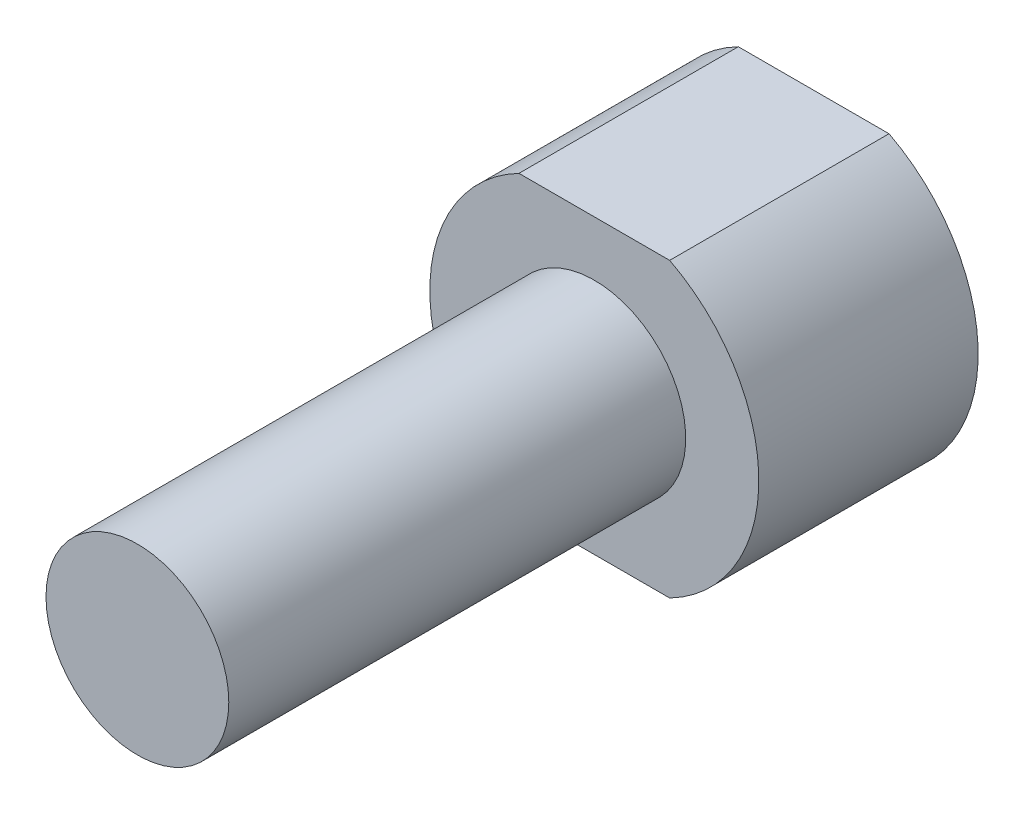
ISO-10303-21;
HEADER;
FILE_DESCRIPTION(('STEP AP214'),'2;1');
FILE_NAME('part.step','',(''),(''),'','','');
FILE_SCHEMA(('AUTOMOTIVE_DESIGN { 1 0 10303 214 1 1 1 1 }'));
ENDSEC;
DATA;
#1=APPLICATION_CONTEXT('core data for automotive mechanical design processes');
#2=APPLICATION_PROTOCOL_DEFINITION('international standard','automotive_design',2000,#1);
#3=PRODUCT_CONTEXT('',#1,'mechanical');
#4=PRODUCT('Part','Part','',(#3));
#5=PRODUCT_RELATED_PRODUCT_CATEGORY('part','',(#4));
#6=PRODUCT_DEFINITION_FORMATION('','',#4);
#7=PRODUCT_DEFINITION_CONTEXT('part definition',#1,'design');
#8=PRODUCT_DEFINITION('design','',#6,#7);
#9=PRODUCT_DEFINITION_SHAPE('','',#8);
#10=(LENGTH_UNIT() NAMED_UNIT(*) SI_UNIT(.MILLI.,.METRE.));
#11=(NAMED_UNIT(*) PLANE_ANGLE_UNIT() SI_UNIT($,.RADIAN.));
#12=(NAMED_UNIT(*) SI_UNIT($,.STERADIAN.) SOLID_ANGLE_UNIT());
#13=UNCERTAINTY_MEASURE_WITH_UNIT(LENGTH_MEASURE(1.E-05),#10,'distance_accuracy_value','');
#14=(GEOMETRIC_REPRESENTATION_CONTEXT(3) GLOBAL_UNCERTAINTY_ASSIGNED_CONTEXT((#13)) GLOBAL_UNIT_ASSIGNED_CONTEXT((#10,
#11,#12)) REPRESENTATION_CONTEXT('',''));
#15=CARTESIAN_POINT('',(0.,0.,0.));
#16=DIRECTION('',(0.,0.,1.));
#17=DIRECTION('',(1.,0.,0.));
#18=AXIS2_PLACEMENT_3D('',#15,#16,#17);
#19=CARTESIAN_POINT('',(0.,0.,12.));
#20=DIRECTION('',(0.,0.,-1.));
#21=DIRECTION('',(-1.,0.,0.));
#22=AXIS2_PLACEMENT_3D('',#19,#20,#21);
#23=CYLINDRICAL_SURFACE('',#22,9.);
#24=CARTESIAN_POINT('',(0.,0.,0.));
#25=DIRECTION('',(0.,0.,1.));
#26=DIRECTION('',(-1.,0.,0.));
#27=AXIS2_PLACEMENT_3D('',#24,#25,#26);
#28=CIRCLE('',#27,9.);
#29=CARTESIAN_POINT('',(4.12310562561766,-8.,0.));
#30=VERTEX_POINT('',#29);
#31=CARTESIAN_POINT('',(4.12310562561766,8.,0.));
#32=VERTEX_POINT('',#31);
#33=EDGE_CURVE('E103',#30,#32,#28,.T.);
#34=ORIENTED_EDGE('',*,*,#33,.T.);
#35=DIRECTION('',(0.,0.,-1.));
#36=VECTOR('',#35,1.);
#37=CARTESIAN_POINT('',(4.12310562561766,8.,12.));
#38=LINE('',#37,#36);
#39=CARTESIAN_POINT('',(4.12310562561766,8.,12.));
#40=VERTEX_POINT('',#39);
#41=EDGE_CURVE('E45',#40,#32,#38,.T.);
#42=ORIENTED_EDGE('',*,*,#41,.F.);
#43=CARTESIAN_POINT('',(0.,0.,12.));
#44=DIRECTION('',(0.,0.,1.));
#45=DIRECTION('',(-1.,0.,0.));
#46=AXIS2_PLACEMENT_3D('',#43,#44,#45);
#47=CIRCLE('',#46,9.);
#48=CARTESIAN_POINT('',(4.12310562561766,-8.,12.));
#49=VERTEX_POINT('',#48);
#50=EDGE_CURVE('E89',#49,#40,#47,.T.);
#51=ORIENTED_EDGE('',*,*,#50,.F.);
#52=DIRECTION('',(0.,0.,-1.));
#53=VECTOR('',#52,1.);
#54=CARTESIAN_POINT('',(4.12310562561766,-8.,12.));
#55=LINE('',#54,#53);
#56=EDGE_CURVE('E99',#49,#30,#55,.T.);
#57=ORIENTED_EDGE('',*,*,#56,.T.);
#58=EDGE_LOOP('',(#34,#42,#51,#57));
#59=FACE_BOUND('',#58,.T.);
#60=ADVANCED_FACE('F37',(#59),#23,.T.);
#61=CARTESIAN_POINT('',(-4.12310562561766,8.,12.));
#62=DIRECTION('',(0.,-1.,0.));
#63=DIRECTION('',(0.,0.,-1.));
#64=AXIS2_PLACEMENT_3D('',#61,#62,#63);
#65=PLANE('',#64);
#66=DIRECTION('',(-1.,0.,0.));
#67=VECTOR('',#66,1.);
#68=CARTESIAN_POINT('',(-4.12310562561766,8.,0.));
#69=LINE('',#68,#67);
#70=CARTESIAN_POINT('',(-4.12310562561766,8.,0.));
#71=VERTEX_POINT('',#70);
#72=EDGE_CURVE('E94',#32,#71,#69,.T.);
#73=ORIENTED_EDGE('',*,*,#72,.T.);
#74=DIRECTION('',(0.,0.,-1.));
#75=VECTOR('',#74,1.);
#76=CARTESIAN_POINT('',(-4.12310562561766,8.,12.));
#77=LINE('',#76,#75);
#78=CARTESIAN_POINT('',(-4.12310562561766,8.,12.));
#79=VERTEX_POINT('',#78);
#80=EDGE_CURVE('E92',#79,#71,#77,.T.);
#81=ORIENTED_EDGE('',*,*,#80,.F.);
#82=DIRECTION('',(-1.,0.,0.));
#83=VECTOR('',#82,1.);
#84=CARTESIAN_POINT('',(-4.12310562561766,8.,12.));
#85=LINE('',#84,#83);
#86=EDGE_CURVE('E84',#40,#79,#85,.T.);
#87=ORIENTED_EDGE('',*,*,#86,.F.);
#88=ORIENTED_EDGE('',*,*,#41,.T.);
#89=EDGE_LOOP('',(#73,#81,#87,#88));
#90=FACE_BOUND('',#89,.T.);
#91=ADVANCED_FACE('F93',(#90),#65,.F.);
#92=CARTESIAN_POINT('',(0.,0.,12.));
#93=DIRECTION('',(0.,0.,-1.));
#94=DIRECTION('',(-1.,0.,0.));
#95=AXIS2_PLACEMENT_3D('',#92,#93,#94);
#96=CYLINDRICAL_SURFACE('',#95,9.);
#97=CARTESIAN_POINT('',(0.,0.,0.));
#98=DIRECTION('',(0.,0.,1.));
#99=DIRECTION('',(1.,0.,0.));
#100=AXIS2_PLACEMENT_3D('',#97,#98,#99);
#101=CIRCLE('',#100,9.);
#102=CARTESIAN_POINT('',(-4.12310562561767,-7.99999999999999,0.));
#103=VERTEX_POINT('',#102);
#104=EDGE_CURVE('E70',#71,#103,#101,.T.);
#105=ORIENTED_EDGE('',*,*,#104,.T.);
#106=DIRECTION('',(0.,0.,-1.));
#107=VECTOR('',#106,1.);
#108=CARTESIAN_POINT('',(-4.12310562561767,-7.99999999999999,12.));
#109=LINE('',#108,#107);
#110=CARTESIAN_POINT('',(-4.12310562561767,-7.99999999999999,12.));
#111=VERTEX_POINT('',#110);
#112=EDGE_CURVE('E95',#111,#103,#109,.T.);
#113=ORIENTED_EDGE('',*,*,#112,.F.);
#114=CARTESIAN_POINT('',(0.,0.,12.));
#115=DIRECTION('',(0.,0.,1.));
#116=DIRECTION('',(1.,0.,0.));
#117=AXIS2_PLACEMENT_3D('',#114,#115,#116);
#118=CIRCLE('',#117,9.);
#119=EDGE_CURVE('E87',#79,#111,#118,.T.);
#120=ORIENTED_EDGE('',*,*,#119,.F.);
#121=ORIENTED_EDGE('',*,*,#80,.T.);
#122=EDGE_LOOP('',(#105,#113,#120,#121));
#123=FACE_BOUND('',#122,.T.);
#124=ADVANCED_FACE('F97',(#123),#96,.T.);
#125=CARTESIAN_POINT('',(4.12310562561766,-8.,12.));
#126=DIRECTION('',(0.,1.,0.));
#127=DIRECTION('',(0.,0.,1.));
#128=AXIS2_PLACEMENT_3D('',#125,#126,#127);
#129=PLANE('',#128);
#130=DIRECTION('',(1.,0.,0.));
#131=VECTOR('',#130,1.);
#132=CARTESIAN_POINT('',(4.12310562561766,-8.,0.));
#133=LINE('',#132,#131);
#134=EDGE_CURVE('E76',#103,#30,#133,.T.);
#135=ORIENTED_EDGE('',*,*,#134,.T.);
#136=ORIENTED_EDGE('',*,*,#56,.F.);
#137=DIRECTION('',(1.,0.,0.));
#138=VECTOR('',#137,1.);
#139=CARTESIAN_POINT('',(4.12310562561766,-8.,12.));
#140=LINE('',#139,#138);
#141=EDGE_CURVE('E53',#111,#49,#140,.T.);
#142=ORIENTED_EDGE('',*,*,#141,.F.);
#143=ORIENTED_EDGE('',*,*,#112,.T.);
#144=EDGE_LOOP('',(#135,#136,#142,#143));
#145=FACE_BOUND('',#144,.T.);
#146=ADVANCED_FACE('F125',(#145),#129,.F.);
#147=CARTESIAN_POINT('',(0.,0.,12.));
#148=DIRECTION('',(0.,0.,-1.));
#149=DIRECTION('',(-1.,0.,0.));
#150=AXIS2_PLACEMENT_3D('',#147,#148,#149);
#151=PLANE('',#150);
#152=CARTESIAN_POINT('',(0.,0.,12.));
#153=DIRECTION('',(0.,0.,-1.));
#154=DIRECTION('',(-1.,0.,0.));
#155=AXIS2_PLACEMENT_3D('',#152,#153,#154);
#156=CIRCLE('',#155,5.);
#157=CARTESIAN_POINT('',(-5.,0.,12.));
#158=VERTEX_POINT('',#157);
#159=EDGE_CURVE('E11',#158,#158,#156,.F.);
#160=ORIENTED_EDGE('',*,*,#159,.F.);
#161=EDGE_LOOP('',(#160));
#162=FACE_BOUND('',#161,.T.);
#163=ORIENTED_EDGE('',*,*,#50,.T.);
#164=ORIENTED_EDGE('',*,*,#86,.T.);
#165=ORIENTED_EDGE('',*,*,#119,.T.);
#166=ORIENTED_EDGE('',*,*,#141,.T.);
#167=EDGE_LOOP('',(#163,#164,#165,#166));
#168=FACE_BOUND('',#167,.T.);
#169=ADVANCED_FACE('F85',(#162,#168),#151,.F.);
#170=CARTESIAN_POINT('',(0.,0.,0.));
#171=DIRECTION('',(0.,0.,-1.));
#172=DIRECTION('',(-1.,0.,0.));
#173=AXIS2_PLACEMENT_3D('',#170,#171,#172);
#174=PLANE('',#173);
#175=ORIENTED_EDGE('',*,*,#33,.F.);
#176=ORIENTED_EDGE('',*,*,#134,.F.);
#177=ORIENTED_EDGE('',*,*,#104,.F.);
#178=ORIENTED_EDGE('',*,*,#72,.F.);
#179=EDGE_LOOP('',(#175,#176,#177,#178));
#180=FACE_BOUND('',#179,.T.);
#181=ADVANCED_FACE('F114',(#180),#174,.T.);
#182=CARTESIAN_POINT('',(0.,0.,37.));
#183=DIRECTION('',(0.,0.,-1.));
#184=DIRECTION('',(-1.,0.,0.));
#185=AXIS2_PLACEMENT_3D('',#182,#183,#184);
#186=CYLINDRICAL_SURFACE('',#185,5.);
#187=CARTESIAN_POINT('',(0.,0.,37.));
#188=DIRECTION('',(0.,0.,1.));
#189=DIRECTION('',(1.,0.,0.));
#190=AXIS2_PLACEMENT_3D('',#187,#188,#189);
#191=CIRCLE('',#190,5.);
#192=CARTESIAN_POINT('',(5.,0.,37.));
#193=VERTEX_POINT('',#192);
#194=EDGE_CURVE('E106',#193,#193,#191,.T.);
#195=ORIENTED_EDGE('',*,*,#194,.F.);
#196=EDGE_LOOP('',(#195));
#197=FACE_BOUND('',#196,.T.);
#198=ORIENTED_EDGE('',*,*,#159,.T.);
#199=EDGE_LOOP('',(#198));
#200=FACE_BOUND('',#199,.T.);
#201=ADVANCED_FACE('F116',(#197,#200),#186,.T.);
#202=CARTESIAN_POINT('',(0.,0.,37.));
#203=DIRECTION('',(0.,0.,1.));
#204=DIRECTION('',(1.,0.,0.));
#205=AXIS2_PLACEMENT_3D('',#202,#203,#204);
#206=PLANE('',#205);
#207=ORIENTED_EDGE('',*,*,#194,.T.);
#208=EDGE_LOOP('',(#207));
#209=FACE_BOUND('',#208,.T.);
#210=ADVANCED_FACE('F122',(#209),#206,.T.);
#211=CLOSED_SHELL('',(#60,#91,#124,#146,#169,#181,#201,#210));
#212=MANIFOLD_SOLID_BREP('B2',#211);
#213=ADVANCED_BREP_SHAPE_REPRESENTATION('',(#18,#212),#14);
#214=SHAPE_DEFINITION_REPRESENTATION(#9,#213);
ENDSEC;
END-ISO-10303-21;
